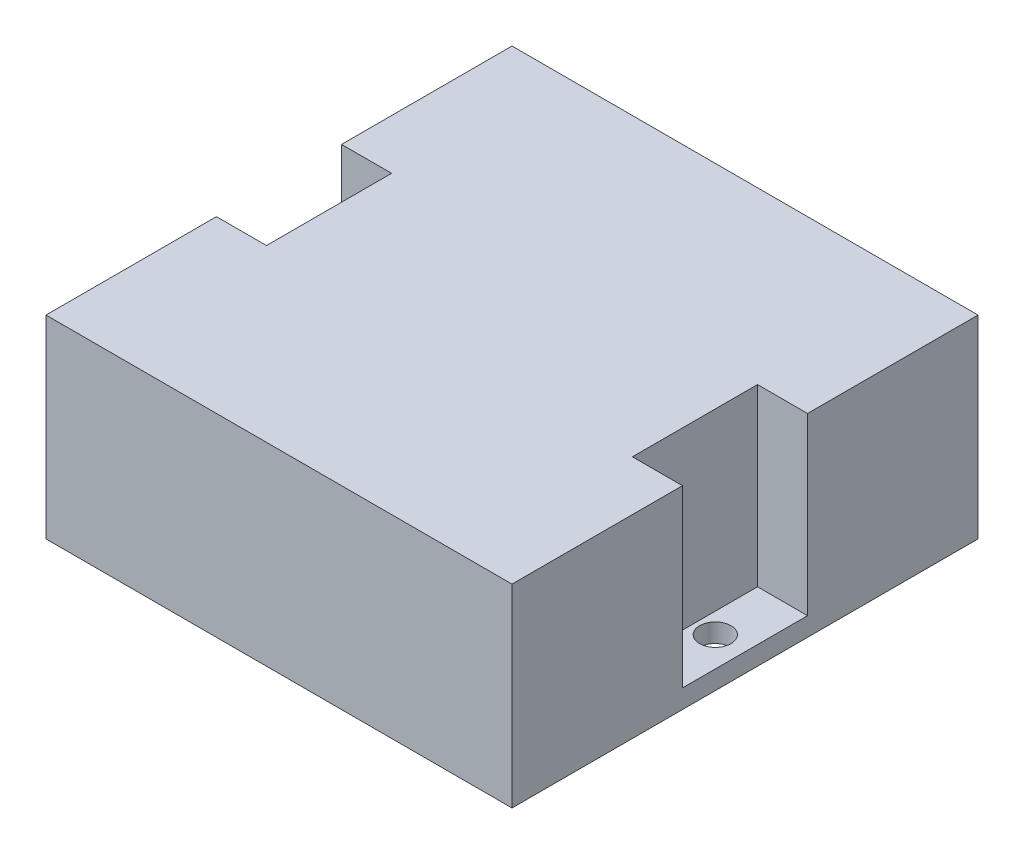
ISO-10303-21;
HEADER;
FILE_DESCRIPTION(('STEP AP214'),'2;1');
FILE_NAME('part.step','',(''),(''),'','','');
FILE_SCHEMA(('AUTOMOTIVE_DESIGN { 1 0 10303 214 1 1 1 1 }'));
ENDSEC;
DATA;
#1=APPLICATION_CONTEXT('core data for automotive mechanical design processes');
#2=APPLICATION_PROTOCOL_DEFINITION('international standard','automotive_design',2000,#1);
#3=PRODUCT_CONTEXT('',#1,'mechanical');
#4=PRODUCT('Part','Part','',(#3));
#5=PRODUCT_RELATED_PRODUCT_CATEGORY('part','',(#4));
#6=PRODUCT_DEFINITION_FORMATION('','',#4);
#7=PRODUCT_DEFINITION_CONTEXT('part definition',#1,'design');
#8=PRODUCT_DEFINITION('design','',#6,#7);
#9=PRODUCT_DEFINITION_SHAPE('','',#8);
#10=(LENGTH_UNIT() NAMED_UNIT(*) SI_UNIT(.MILLI.,.METRE.));
#11=(NAMED_UNIT(*) PLANE_ANGLE_UNIT() SI_UNIT($,.RADIAN.));
#12=(NAMED_UNIT(*) SI_UNIT($,.STERADIAN.) SOLID_ANGLE_UNIT());
#13=UNCERTAINTY_MEASURE_WITH_UNIT(LENGTH_MEASURE(1.E-05),#10,'distance_accuracy_value','');
#14=(GEOMETRIC_REPRESENTATION_CONTEXT(3) GLOBAL_UNCERTAINTY_ASSIGNED_CONTEXT((#13)) GLOBAL_UNIT_ASSIGNED_CONTEXT((#10,
#11,#12)) REPRESENTATION_CONTEXT('',''));
#15=CARTESIAN_POINT('',(0.,0.,0.));
#16=DIRECTION('',(0.,0.,1.));
#17=DIRECTION('',(1.,0.,0.));
#18=AXIS2_PLACEMENT_3D('',#15,#16,#17);
#19=CARTESIAN_POINT('',(-37.25,31.,-37.25));
#20=DIRECTION('',(0.,0.,-1.));
#21=DIRECTION('',(-1.,0.,0.));
#22=AXIS2_PLACEMENT_3D('',#19,#20,#21);
#23=PLANE('',#22);
#24=DIRECTION('',(1.,0.,0.));
#25=VECTOR('',#24,1.);
#26=CARTESIAN_POINT('',(-37.25,0.,-37.25));
#27=LINE('',#26,#25);
#28=CARTESIAN_POINT('',(-37.25,0.,-37.25));
#29=VERTEX_POINT('',#28);
#30=CARTESIAN_POINT('',(37.25,0.,-37.25));
#31=VERTEX_POINT('',#30);
#32=EDGE_CURVE('E202',#29,#31,#27,.T.);
#33=ORIENTED_EDGE('',*,*,#32,.F.);
#34=DIRECTION('',(0.,-1.,0.));
#35=VECTOR('',#34,1.);
#36=CARTESIAN_POINT('',(-37.25,31.,-37.25));
#37=LINE('',#36,#35);
#38=CARTESIAN_POINT('',(-37.25,31.,-37.25));
#39=VERTEX_POINT('',#38);
#40=EDGE_CURVE('E11',#39,#29,#37,.T.);
#41=ORIENTED_EDGE('',*,*,#40,.F.);
#42=DIRECTION('',(1.,0.,0.));
#43=VECTOR('',#42,1.);
#44=CARTESIAN_POINT('',(-37.25,31.,-37.25));
#45=LINE('',#44,#43);
#46=CARTESIAN_POINT('',(37.25,31.,-37.25));
#47=VERTEX_POINT('',#46);
#48=EDGE_CURVE('E190',#39,#47,#45,.T.);
#49=ORIENTED_EDGE('',*,*,#48,.T.);
#50=DIRECTION('',(0.,-1.,0.));
#51=VECTOR('',#50,1.);
#52=CARTESIAN_POINT('',(37.25,31.,-37.25));
#53=LINE('',#52,#51);
#54=EDGE_CURVE('E48',#47,#31,#53,.T.);
#55=ORIENTED_EDGE('',*,*,#54,.T.);
#56=EDGE_LOOP('',(#33,#41,#49,#55));
#57=FACE_BOUND('',#56,.T.);
#58=ADVANCED_FACE('F45',(#57),#23,.T.);
#59=CARTESIAN_POINT('',(-37.25,31.,37.25));
#60=DIRECTION('',(-1.,0.,0.));
#61=DIRECTION('',(0.,0.,1.));
#62=AXIS2_PLACEMENT_3D('',#59,#60,#61);
#63=PLANE('',#62);
#64=DIRECTION('',(0.,1.,0.));
#65=VECTOR('',#64,1.);
#66=CARTESIAN_POINT('',(-37.25,3.,-10.));
#67=LINE('',#66,#65);
#68=CARTESIAN_POINT('',(-37.25,3.,-10.));
#69=VERTEX_POINT('',#68);
#70=CARTESIAN_POINT('',(-37.25,31.,-10.));
#71=VERTEX_POINT('',#70);
#72=EDGE_CURVE('E206',#69,#71,#67,.T.);
#73=ORIENTED_EDGE('',*,*,#72,.T.);
#74=DIRECTION('',(0.,0.,-1.));
#75=VECTOR('',#74,1.);
#76=CARTESIAN_POINT('',(-37.25,31.,37.25));
#77=LINE('',#76,#75);
#78=EDGE_CURVE('E200',#71,#39,#77,.T.);
#79=ORIENTED_EDGE('',*,*,#78,.T.);
#80=ORIENTED_EDGE('',*,*,#40,.T.);
#81=DIRECTION('',(0.,0.,-1.));
#82=VECTOR('',#81,1.);
#83=CARTESIAN_POINT('',(-37.25,0.,37.25));
#84=LINE('',#83,#82);
#85=CARTESIAN_POINT('',(-37.25,0.,37.25));
#86=VERTEX_POINT('',#85);
#87=EDGE_CURVE('E194',#86,#29,#84,.T.);
#88=ORIENTED_EDGE('',*,*,#87,.F.);
#89=DIRECTION('',(0.,-1.,0.));
#90=VECTOR('',#89,1.);
#91=CARTESIAN_POINT('',(-37.25,31.,37.25));
#92=LINE('',#91,#90);
#93=CARTESIAN_POINT('',(-37.25,31.,37.25));
#94=VERTEX_POINT('',#93);
#95=EDGE_CURVE('E53',#94,#86,#92,.T.);
#96=ORIENTED_EDGE('',*,*,#95,.F.);
#97=CARTESIAN_POINT('',(-37.25,31.,9.99999999999999));
#98=VERTEX_POINT('',#97);
#99=EDGE_CURVE('E155',#94,#98,#77,.T.);
#100=ORIENTED_EDGE('',*,*,#99,.T.);
#101=DIRECTION('',(0.,1.,0.));
#102=VECTOR('',#101,1.);
#103=CARTESIAN_POINT('',(-37.25,3.,10.));
#104=LINE('',#103,#102);
#105=CARTESIAN_POINT('',(-37.25,3.,10.));
#106=VERTEX_POINT('',#105);
#107=EDGE_CURVE('E69',#106,#98,#104,.T.);
#108=ORIENTED_EDGE('',*,*,#107,.F.);
#109=DIRECTION('',(0.,0.,1.));
#110=VECTOR('',#109,1.);
#111=CARTESIAN_POINT('',(-37.25,3.,-10.));
#112=LINE('',#111,#110);
#113=EDGE_CURVE('E141',#69,#106,#112,.T.);
#114=ORIENTED_EDGE('',*,*,#113,.F.);
#115=EDGE_LOOP('',(#73,#79,#80,#88,#96,#100,#108,#114));
#116=FACE_BOUND('',#115,.T.);
#117=ADVANCED_FACE('F153',(#116),#63,.T.);
#118=CARTESIAN_POINT('',(-37.25,31.,37.25));
#119=DIRECTION('',(0.,0.,-1.));
#120=DIRECTION('',(-1.,0.,0.));
#121=AXIS2_PLACEMENT_3D('',#118,#119,#120);
#122=PLANE('',#121);
#123=DIRECTION('',(1.,0.,0.));
#124=VECTOR('',#123,1.);
#125=CARTESIAN_POINT('',(-37.25,0.,37.25));
#126=LINE('',#125,#124);
#127=CARTESIAN_POINT('',(37.25,0.,37.25));
#128=VERTEX_POINT('',#127);
#129=EDGE_CURVE('E209',#86,#128,#126,.T.);
#130=ORIENTED_EDGE('',*,*,#129,.T.);
#131=DIRECTION('',(0.,-1.,0.));
#132=VECTOR('',#131,1.);
#133=CARTESIAN_POINT('',(37.25,31.,37.25));
#134=LINE('',#133,#132);
#135=CARTESIAN_POINT('',(37.25,31.,37.25));
#136=VERTEX_POINT('',#135);
#137=EDGE_CURVE('E213',#136,#128,#134,.T.);
#138=ORIENTED_EDGE('',*,*,#137,.F.);
#139=DIRECTION('',(1.,0.,0.));
#140=VECTOR('',#139,1.);
#141=CARTESIAN_POINT('',(-37.25,31.,37.25));
#142=LINE('',#141,#140);
#143=EDGE_CURVE('E198',#94,#136,#142,.T.);
#144=ORIENTED_EDGE('',*,*,#143,.F.);
#145=ORIENTED_EDGE('',*,*,#95,.T.);
#146=EDGE_LOOP('',(#130,#138,#144,#145));
#147=FACE_BOUND('',#146,.T.);
#148=ADVANCED_FACE('F249',(#147),#122,.F.);
#149=CARTESIAN_POINT('',(37.25,31.,37.25));
#150=DIRECTION('',(-1.,0.,0.));
#151=DIRECTION('',(0.,0.,1.));
#152=AXIS2_PLACEMENT_3D('',#149,#150,#151);
#153=PLANE('',#152);
#154=DIRECTION('',(0.,0.,-1.));
#155=VECTOR('',#154,1.);
#156=CARTESIAN_POINT('',(37.25,31.,37.25));
#157=LINE('',#156,#155);
#158=CARTESIAN_POINT('',(37.25,31.,-10.));
#159=VERTEX_POINT('',#158);
#160=EDGE_CURVE('E193',#159,#47,#157,.T.);
#161=ORIENTED_EDGE('',*,*,#160,.F.);
#162=DIRECTION('',(0.,1.,0.));
#163=VECTOR('',#162,1.);
#164=CARTESIAN_POINT('',(37.25,3.,-10.));
#165=LINE('',#164,#163);
#166=CARTESIAN_POINT('',(37.25,3.,-10.));
#167=VERTEX_POINT('',#166);
#168=EDGE_CURVE('E168',#167,#159,#165,.T.);
#169=ORIENTED_EDGE('',*,*,#168,.F.);
#170=DIRECTION('',(0.,0.,-1.));
#171=VECTOR('',#170,1.);
#172=CARTESIAN_POINT('',(37.25,3.,-10.));
#173=LINE('',#172,#171);
#174=CARTESIAN_POINT('',(37.25,3.,9.99999999999999));
#175=VERTEX_POINT('',#174);
#176=EDGE_CURVE('E183',#175,#167,#173,.T.);
#177=ORIENTED_EDGE('',*,*,#176,.F.);
#178=DIRECTION('',(0.,1.,0.));
#179=VECTOR('',#178,1.);
#180=CARTESIAN_POINT('',(37.25,3.,9.99999999999999));
#181=LINE('',#180,#179);
#182=CARTESIAN_POINT('',(37.25,31.,9.99999999999999));
#183=VERTEX_POINT('',#182);
#184=EDGE_CURVE('E165',#175,#183,#181,.T.);
#185=ORIENTED_EDGE('',*,*,#184,.T.);
#186=EDGE_CURVE('E195',#136,#183,#157,.T.);
#187=ORIENTED_EDGE('',*,*,#186,.F.);
#188=ORIENTED_EDGE('',*,*,#137,.T.);
#189=DIRECTION('',(0.,0.,-1.));
#190=VECTOR('',#189,1.);
#191=CARTESIAN_POINT('',(37.25,0.,37.25));
#192=LINE('',#191,#190);
#193=EDGE_CURVE('E205',#128,#31,#192,.T.);
#194=ORIENTED_EDGE('',*,*,#193,.T.);
#195=ORIENTED_EDGE('',*,*,#54,.F.);
#196=EDGE_LOOP('',(#161,#169,#177,#185,#187,#188,#194,#195));
#197=FACE_BOUND('',#196,.T.);
#198=ADVANCED_FACE('F225',(#197),#153,.F.);
#199=CARTESIAN_POINT('',(0.,31.,0.));
#200=DIRECTION('',(0.,1.,0.));
#201=DIRECTION('',(0.,0.,1.));
#202=AXIS2_PLACEMENT_3D('',#199,#200,#201);
#203=PLANE('',#202);
#204=DIRECTION('',(-1.,0.,0.));
#205=VECTOR('',#204,1.);
#206=CARTESIAN_POINT('',(-29.25,31.,-10.));
#207=LINE('',#206,#205);
#208=CARTESIAN_POINT('',(-29.25,31.,-10.));
#209=VERTEX_POINT('',#208);
#210=EDGE_CURVE('E150',#209,#71,#207,.T.);
#211=ORIENTED_EDGE('',*,*,#210,.F.);
#212=DIRECTION('',(0.,0.,-1.));
#213=VECTOR('',#212,1.);
#214=CARTESIAN_POINT('',(-29.25,31.,-10.));
#215=LINE('',#214,#213);
#216=CARTESIAN_POINT('',(-29.25,31.,10.));
#217=VERTEX_POINT('',#216);
#218=EDGE_CURVE('E414',#217,#209,#215,.T.);
#219=ORIENTED_EDGE('',*,*,#218,.F.);
#220=DIRECTION('',(1.,0.,0.));
#221=VECTOR('',#220,1.);
#222=CARTESIAN_POINT('',(-29.25,31.,10.));
#223=LINE('',#222,#221);
#224=EDGE_CURVE('E180',#98,#217,#223,.T.);
#225=ORIENTED_EDGE('',*,*,#224,.F.);
#226=ORIENTED_EDGE('',*,*,#99,.F.);
#227=ORIENTED_EDGE('',*,*,#143,.T.);
#228=ORIENTED_EDGE('',*,*,#186,.T.);
#229=DIRECTION('',(1.,0.,0.));
#230=VECTOR('',#229,1.);
#231=CARTESIAN_POINT('',(29.25,31.,9.99999999999999));
#232=LINE('',#231,#230);
#233=CARTESIAN_POINT('',(29.25,31.,9.99999999999999));
#234=VERTEX_POINT('',#233);
#235=EDGE_CURVE('E176',#234,#183,#232,.T.);
#236=ORIENTED_EDGE('',*,*,#235,.F.);
#237=DIRECTION('',(0.,0.,1.));
#238=VECTOR('',#237,1.);
#239=CARTESIAN_POINT('',(29.25,31.,-10.));
#240=LINE('',#239,#238);
#241=CARTESIAN_POINT('',(29.25,31.,-10.));
#242=VERTEX_POINT('',#241);
#243=EDGE_CURVE('E61',#242,#234,#240,.T.);
#244=ORIENTED_EDGE('',*,*,#243,.F.);
#245=DIRECTION('',(-1.,0.,0.));
#246=VECTOR('',#245,1.);
#247=CARTESIAN_POINT('',(29.25,31.,-10.));
#248=LINE('',#247,#246);
#249=EDGE_CURVE('E173',#159,#242,#248,.T.);
#250=ORIENTED_EDGE('',*,*,#249,.F.);
#251=ORIENTED_EDGE('',*,*,#160,.T.);
#252=ORIENTED_EDGE('',*,*,#48,.F.);
#253=ORIENTED_EDGE('',*,*,#78,.F.);
#254=EDGE_LOOP('',(#211,#219,#225,#226,#227,#228,#236,#244,#250,#251,#252,#253));
#255=FACE_BOUND('',#254,.T.);
#256=ADVANCED_FACE('F234',(#255),#203,.T.);
#257=CARTESIAN_POINT('',(0.,0.,0.));
#258=DIRECTION('',(0.,1.,0.));
#259=DIRECTION('',(0.,0.,1.));
#260=AXIS2_PLACEMENT_3D('',#257,#258,#259);
#261=PLANE('',#260);
#262=CARTESIAN_POINT('',(-32.5,0.,0.));
#263=DIRECTION('',(0.,1.,0.));
#264=DIRECTION('',(0.,0.,1.));
#265=AXIS2_PLACEMENT_3D('',#262,#263,#264);
#266=CIRCLE('',#265,2.5);
#267=CARTESIAN_POINT('',(-32.5,0.,2.5));
#268=VERTEX_POINT('',#267);
#269=EDGE_CURVE('E172',#268,#268,#266,.T.);
#270=ORIENTED_EDGE('',*,*,#269,.T.);
#271=EDGE_LOOP('',(#270));
#272=FACE_BOUND('',#271,.T.);
#273=CARTESIAN_POINT('',(32.5,0.,0.));
#274=DIRECTION('',(0.,1.,0.));
#275=DIRECTION('',(0.,0.,1.));
#276=AXIS2_PLACEMENT_3D('',#273,#274,#275);
#277=CIRCLE('',#276,2.5);
#278=CARTESIAN_POINT('',(32.5,0.,2.49999999999999));
#279=VERTEX_POINT('',#278);
#280=EDGE_CURVE('E421',#279,#279,#277,.T.);
#281=ORIENTED_EDGE('',*,*,#280,.T.);
#282=EDGE_LOOP('',(#281));
#283=FACE_BOUND('',#282,.T.);
#284=ORIENTED_EDGE('',*,*,#32,.T.);
#285=ORIENTED_EDGE('',*,*,#193,.F.);
#286=ORIENTED_EDGE('',*,*,#129,.F.);
#287=ORIENTED_EDGE('',*,*,#87,.T.);
#288=EDGE_LOOP('',(#284,#285,#286,#287));
#289=FACE_BOUND('',#288,.T.);
#290=ADVANCED_FACE('F228',(#272,#283,#289),#261,.F.);
#291=CARTESIAN_POINT('',(29.25,3.,-10.));
#292=DIRECTION('',(-1.,0.,0.));
#293=DIRECTION('',(0.,0.,1.));
#294=AXIS2_PLACEMENT_3D('',#291,#292,#293);
#295=PLANE('',#294);
#296=ORIENTED_EDGE('',*,*,#243,.T.);
#297=DIRECTION('',(0.,1.,0.));
#298=VECTOR('',#297,1.);
#299=CARTESIAN_POINT('',(29.25,3.,9.99999999999999));
#300=LINE('',#299,#298);
#301=CARTESIAN_POINT('',(29.25,3.,9.99999999999999));
#302=VERTEX_POINT('',#301);
#303=EDGE_CURVE('E162',#302,#234,#300,.T.);
#304=ORIENTED_EDGE('',*,*,#303,.F.);
#305=DIRECTION('',(0.,0.,1.));
#306=VECTOR('',#305,1.);
#307=CARTESIAN_POINT('',(29.25,3.,-10.));
#308=LINE('',#307,#306);
#309=CARTESIAN_POINT('',(29.25,3.,-10.));
#310=VERTEX_POINT('',#309);
#311=EDGE_CURVE('E177',#310,#302,#308,.T.);
#312=ORIENTED_EDGE('',*,*,#311,.F.);
#313=DIRECTION('',(0.,1.,0.));
#314=VECTOR('',#313,1.);
#315=CARTESIAN_POINT('',(29.25,3.,-10.));
#316=LINE('',#315,#314);
#317=EDGE_CURVE('E170',#310,#242,#316,.T.);
#318=ORIENTED_EDGE('',*,*,#317,.T.);
#319=EDGE_LOOP('',(#296,#304,#312,#318));
#320=FACE_BOUND('',#319,.T.);
#321=ADVANCED_FACE('F291',(#320),#295,.F.);
#322=CARTESIAN_POINT('',(29.25,3.,-10.));
#323=DIRECTION('',(0.,0.,-1.));
#324=DIRECTION('',(-1.,0.,0.));
#325=AXIS2_PLACEMENT_3D('',#322,#323,#324);
#326=PLANE('',#325);
#327=ORIENTED_EDGE('',*,*,#249,.T.);
#328=ORIENTED_EDGE('',*,*,#317,.F.);
#329=DIRECTION('',(-1.,0.,0.));
#330=VECTOR('',#329,1.);
#331=CARTESIAN_POINT('',(29.25,3.,-10.));
#332=LINE('',#331,#330);
#333=EDGE_CURVE('E164',#167,#310,#332,.T.);
#334=ORIENTED_EDGE('',*,*,#333,.F.);
#335=ORIENTED_EDGE('',*,*,#168,.T.);
#336=EDGE_LOOP('',(#327,#328,#334,#335));
#337=FACE_BOUND('',#336,.T.);
#338=ADVANCED_FACE('F240',(#337),#326,.F.);
#339=CARTESIAN_POINT('',(29.25,3.,9.99999999999999));
#340=DIRECTION('',(0.,0.,1.));
#341=DIRECTION('',(1.,0.,0.));
#342=AXIS2_PLACEMENT_3D('',#339,#340,#341);
#343=PLANE('',#342);
#344=ORIENTED_EDGE('',*,*,#235,.T.);
#345=ORIENTED_EDGE('',*,*,#184,.F.);
#346=DIRECTION('',(1.,0.,0.));
#347=VECTOR('',#346,1.);
#348=CARTESIAN_POINT('',(29.25,3.,9.99999999999999));
#349=LINE('',#348,#347);
#350=EDGE_CURVE('E185',#302,#175,#349,.T.);
#351=ORIENTED_EDGE('',*,*,#350,.F.);
#352=ORIENTED_EDGE('',*,*,#303,.T.);
#353=EDGE_LOOP('',(#344,#345,#351,#352));
#354=FACE_BOUND('',#353,.T.);
#355=ADVANCED_FACE('F246',(#354),#343,.F.);
#356=CARTESIAN_POINT('',(0.,3.,0.));
#357=DIRECTION('',(0.,1.,0.));
#358=DIRECTION('',(0.,0.,1.));
#359=AXIS2_PLACEMENT_3D('',#356,#357,#358);
#360=PLANE('',#359);
#361=CARTESIAN_POINT('',(32.5,3.,0.));
#362=DIRECTION('',(0.,1.,0.));
#363=DIRECTION('',(0.,0.,1.));
#364=AXIS2_PLACEMENT_3D('',#361,#362,#363);
#365=CIRCLE('',#364,2.5);
#366=CARTESIAN_POINT('',(32.5,3.,2.49999999999999));
#367=VERTEX_POINT('',#366);
#368=EDGE_CURVE('E424',#367,#367,#365,.T.);
#369=ORIENTED_EDGE('',*,*,#368,.F.);
#370=EDGE_LOOP('',(#369));
#371=FACE_BOUND('',#370,.T.);
#372=ORIENTED_EDGE('',*,*,#311,.T.);
#373=ORIENTED_EDGE('',*,*,#350,.T.);
#374=ORIENTED_EDGE('',*,*,#176,.T.);
#375=ORIENTED_EDGE('',*,*,#333,.T.);
#376=EDGE_LOOP('',(#372,#373,#374,#375));
#377=FACE_BOUND('',#376,.T.);
#378=ADVANCED_FACE('F243',(#371,#377),#360,.T.);
#379=CARTESIAN_POINT('',(-29.25,3.,-10.));
#380=DIRECTION('',(0.,0.,-1.));
#381=DIRECTION('',(-1.,0.,0.));
#382=AXIS2_PLACEMENT_3D('',#379,#380,#381);
#383=PLANE('',#382);
#384=ORIENTED_EDGE('',*,*,#210,.T.);
#385=ORIENTED_EDGE('',*,*,#72,.F.);
#386=DIRECTION('',(-1.,0.,0.));
#387=VECTOR('',#386,1.);
#388=CARTESIAN_POINT('',(-29.25,3.,-10.));
#389=LINE('',#388,#387);
#390=CARTESIAN_POINT('',(-29.25,3.,-10.));
#391=VERTEX_POINT('',#390);
#392=EDGE_CURVE('E147',#391,#69,#389,.T.);
#393=ORIENTED_EDGE('',*,*,#392,.F.);
#394=DIRECTION('',(0.,1.,0.));
#395=VECTOR('',#394,1.);
#396=CARTESIAN_POINT('',(-29.25,3.,-10.));
#397=LINE('',#396,#395);
#398=EDGE_CURVE('E157',#391,#209,#397,.T.);
#399=ORIENTED_EDGE('',*,*,#398,.T.);
#400=EDGE_LOOP('',(#384,#385,#393,#399));
#401=FACE_BOUND('',#400,.T.);
#402=ADVANCED_FACE('F309',(#401),#383,.F.);
#403=CARTESIAN_POINT('',(-29.25,3.,-10.));
#404=DIRECTION('',(1.,0.,0.));
#405=DIRECTION('',(0.,0.,-1.));
#406=AXIS2_PLACEMENT_3D('',#403,#404,#405);
#407=PLANE('',#406);
#408=ORIENTED_EDGE('',*,*,#218,.T.);
#409=ORIENTED_EDGE('',*,*,#398,.F.);
#410=DIRECTION('',(0.,0.,-1.));
#411=VECTOR('',#410,1.);
#412=CARTESIAN_POINT('',(-29.25,3.,-10.));
#413=LINE('',#412,#411);
#414=CARTESIAN_POINT('',(-29.25,3.,10.));
#415=VERTEX_POINT('',#414);
#416=EDGE_CURVE('E140',#415,#391,#413,.T.);
#417=ORIENTED_EDGE('',*,*,#416,.F.);
#418=DIRECTION('',(0.,1.,0.));
#419=VECTOR('',#418,1.);
#420=CARTESIAN_POINT('',(-29.25,3.,10.));
#421=LINE('',#420,#419);
#422=EDGE_CURVE('E136',#415,#217,#421,.T.);
#423=ORIENTED_EDGE('',*,*,#422,.T.);
#424=EDGE_LOOP('',(#408,#409,#417,#423));
#425=FACE_BOUND('',#424,.T.);
#426=ADVANCED_FACE('F348',(#425),#407,.F.);
#427=CARTESIAN_POINT('',(-29.25,3.,10.));
#428=DIRECTION('',(0.,0.,1.));
#429=DIRECTION('',(1.,0.,0.));
#430=AXIS2_PLACEMENT_3D('',#427,#428,#429);
#431=PLANE('',#430);
#432=ORIENTED_EDGE('',*,*,#224,.T.);
#433=ORIENTED_EDGE('',*,*,#422,.F.);
#434=DIRECTION('',(1.,0.,0.));
#435=VECTOR('',#434,1.);
#436=CARTESIAN_POINT('',(-29.25,3.,10.));
#437=LINE('',#436,#435);
#438=EDGE_CURVE('E133',#106,#415,#437,.T.);
#439=ORIENTED_EDGE('',*,*,#438,.F.);
#440=ORIENTED_EDGE('',*,*,#107,.T.);
#441=EDGE_LOOP('',(#432,#433,#439,#440));
#442=FACE_BOUND('',#441,.T.);
#443=ADVANCED_FACE('F135',(#442),#431,.F.);
#444=CARTESIAN_POINT('',(0.,3.,0.));
#445=DIRECTION('',(0.,-1.,0.));
#446=DIRECTION('',(0.,0.,-1.));
#447=AXIS2_PLACEMENT_3D('',#444,#445,#446);
#448=PLANE('',#447);
#449=CARTESIAN_POINT('',(-32.5,3.,0.));
#450=DIRECTION('',(0.,1.,0.));
#451=DIRECTION('',(0.,0.,1.));
#452=AXIS2_PLACEMENT_3D('',#449,#450,#451);
#453=CIRCLE('',#452,2.5);
#454=CARTESIAN_POINT('',(-32.5,3.,2.5));
#455=VERTEX_POINT('',#454);
#456=EDGE_CURVE('E427',#455,#455,#453,.T.);
#457=ORIENTED_EDGE('',*,*,#456,.F.);
#458=EDGE_LOOP('',(#457));
#459=FACE_BOUND('',#458,.T.);
#460=ORIENTED_EDGE('',*,*,#113,.T.);
#461=ORIENTED_EDGE('',*,*,#438,.T.);
#462=ORIENTED_EDGE('',*,*,#416,.T.);
#463=ORIENTED_EDGE('',*,*,#392,.T.);
#464=EDGE_LOOP('',(#460,#461,#462,#463));
#465=FACE_BOUND('',#464,.T.);
#466=ADVANCED_FACE('F145',(#459,#465),#448,.F.);
#467=CARTESIAN_POINT('',(-32.5,0.,0.));
#468=DIRECTION('',(0.,1.,0.));
#469=DIRECTION('',(0.,0.,1.));
#470=AXIS2_PLACEMENT_3D('',#467,#468,#469);
#471=CYLINDRICAL_SURFACE('',#470,2.5);
#472=ORIENTED_EDGE('',*,*,#269,.F.);
#473=EDGE_LOOP('',(#472));
#474=FACE_BOUND('',#473,.T.);
#475=ORIENTED_EDGE('',*,*,#456,.T.);
#476=EDGE_LOOP('',(#475));
#477=FACE_BOUND('',#476,.T.);
#478=ADVANCED_FACE('F320',(#474,#477),#471,.F.);
#479=CARTESIAN_POINT('',(32.5,0.,0.));
#480=DIRECTION('',(0.,1.,0.));
#481=DIRECTION('',(0.,0.,1.));
#482=AXIS2_PLACEMENT_3D('',#479,#480,#481);
#483=CYLINDRICAL_SURFACE('',#482,2.5);
#484=ORIENTED_EDGE('',*,*,#280,.F.);
#485=EDGE_LOOP('',(#484));
#486=FACE_BOUND('',#485,.T.);
#487=ORIENTED_EDGE('',*,*,#368,.T.);
#488=EDGE_LOOP('',(#487));
#489=FACE_BOUND('',#488,.T.);
#490=ADVANCED_FACE('F329',(#486,#489),#483,.F.);
#491=CLOSED_SHELL('',(#58,#117,#148,#198,#256,#290,#321,#338,#355,#378,#402,#426,#443,#466,#478,#490));
#492=MANIFOLD_SOLID_BREP('B2',#491);
#493=ADVANCED_BREP_SHAPE_REPRESENTATION('',(#18,#492),#14);
#494=SHAPE_DEFINITION_REPRESENTATION(#9,#493);
ENDSEC;
END-ISO-10303-21;
